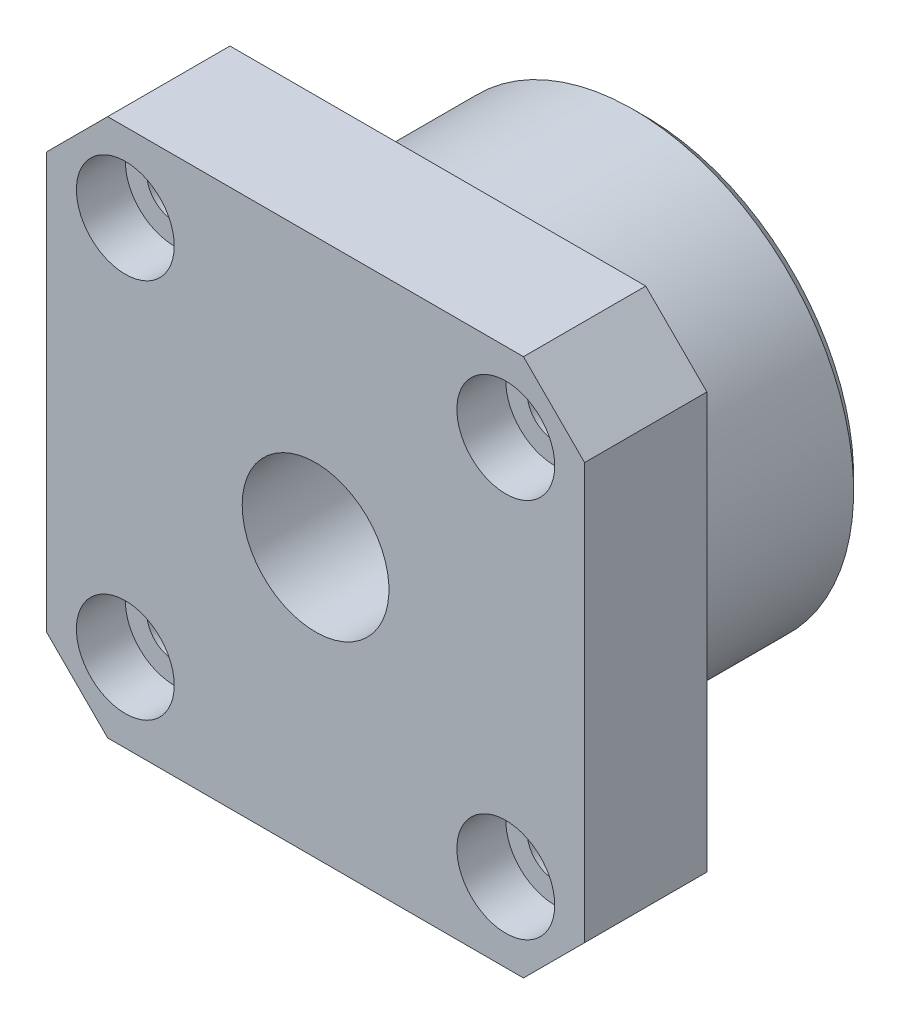
ISO-10303-21;
HEADER;
FILE_DESCRIPTION(('STEP AP214'),'2;1');
FILE_NAME('part.step','',(''),(''),'','','');
FILE_SCHEMA(('AUTOMOTIVE_DESIGN { 1 0 10303 214 1 1 1 1 }'));
ENDSEC;
DATA;
#1=APPLICATION_CONTEXT('core data for automotive mechanical design processes');
#2=APPLICATION_PROTOCOL_DEFINITION('international standard','automotive_design',2000,#1);
#3=PRODUCT_CONTEXT('',#1,'mechanical');
#4=PRODUCT('Part','Part','',(#3));
#5=PRODUCT_RELATED_PRODUCT_CATEGORY('part','',(#4));
#6=PRODUCT_DEFINITION_FORMATION('','',#4);
#7=PRODUCT_DEFINITION_CONTEXT('part definition',#1,'design');
#8=PRODUCT_DEFINITION('design','',#6,#7);
#9=PRODUCT_DEFINITION_SHAPE('','',#8);
#10=(LENGTH_UNIT() NAMED_UNIT(*) SI_UNIT(.MILLI.,.METRE.));
#11=(NAMED_UNIT(*) PLANE_ANGLE_UNIT() SI_UNIT($,.RADIAN.));
#12=(NAMED_UNIT(*) SI_UNIT($,.STERADIAN.) SOLID_ANGLE_UNIT());
#13=UNCERTAINTY_MEASURE_WITH_UNIT(LENGTH_MEASURE(1.E-05),#10,'distance_accuracy_value','');
#14=(GEOMETRIC_REPRESENTATION_CONTEXT(3) GLOBAL_UNCERTAINTY_ASSIGNED_CONTEXT((#13)) GLOBAL_UNIT_ASSIGNED_CONTEXT((#10,
#11,#12)) REPRESENTATION_CONTEXT('',''));
#15=CARTESIAN_POINT('',(0.,0.,0.));
#16=DIRECTION('',(0.,0.,1.));
#17=DIRECTION('',(1.,0.,0.));
#18=AXIS2_PLACEMENT_3D('',#15,#16,#17);
#19=CARTESIAN_POINT('',(0.,0.,0.));
#20=DIRECTION('',(0.,0.,-1.));
#21=DIRECTION('',(-1.,0.,0.));
#22=AXIS2_PLACEMENT_3D('',#19,#20,#21);
#23=PLANE('',#22);
#24=CARTESIAN_POINT('',(-15.5563491861042,-15.5563491861039,0.));
#25=DIRECTION('',(0.,0.,-1.));
#26=DIRECTION('',(-1.,0.,0.));
#27=AXIS2_PLACEMENT_3D('',#24,#25,#26);
#28=CIRCLE('',#27,2.25);
#29=CARTESIAN_POINT('',(-17.8063491861042,-15.5563491861039,0.));
#30=VERTEX_POINT('',#29);
#31=EDGE_CURVE('E134',#30,#30,#28,.T.);
#32=ORIENTED_EDGE('',*,*,#31,.F.);
#33=EDGE_LOOP('',(#32));
#34=FACE_BOUND('',#33,.T.);
#35=CARTESIAN_POINT('',(15.5563491861041,-15.556349186104,0.));
#36=DIRECTION('',(0.,0.,-1.));
#37=DIRECTION('',(-1.,0.,0.));
#38=AXIS2_PLACEMENT_3D('',#35,#36,#37);
#39=CIRCLE('',#38,2.25);
#40=CARTESIAN_POINT('',(13.3063491861041,-15.556349186104,0.));
#41=VERTEX_POINT('',#40);
#42=EDGE_CURVE('E129',#41,#41,#39,.T.);
#43=ORIENTED_EDGE('',*,*,#42,.F.);
#44=EDGE_LOOP('',(#43));
#45=FACE_BOUND('',#44,.T.);
#46=CARTESIAN_POINT('',(15.556349186104,15.556349186104,0.));
#47=DIRECTION('',(0.,0.,-1.));
#48=DIRECTION('',(-1.,0.,0.));
#49=AXIS2_PLACEMENT_3D('',#46,#47,#48);
#50=CIRCLE('',#49,2.25);
#51=CARTESIAN_POINT('',(13.306349186104,15.556349186104,0.));
#52=VERTEX_POINT('',#51);
#53=EDGE_CURVE('E124',#52,#52,#50,.T.);
#54=ORIENTED_EDGE('',*,*,#53,.F.);
#55=EDGE_LOOP('',(#54));
#56=FACE_BOUND('',#55,.T.);
#57=CARTESIAN_POINT('',(-15.5563491861041,15.556349186104,0.));
#58=DIRECTION('',(0.,0.,-1.));
#59=DIRECTION('',(-1.,0.,0.));
#60=AXIS2_PLACEMENT_3D('',#57,#58,#59);
#61=CIRCLE('',#60,2.25);
#62=CARTESIAN_POINT('',(-17.8063491861041,15.556349186104,0.));
#63=VERTEX_POINT('',#62);
#64=EDGE_CURVE('E119',#63,#63,#61,.T.);
#65=ORIENTED_EDGE('',*,*,#64,.F.);
#66=EDGE_LOOP('',(#65));
#67=FACE_BOUND('',#66,.T.);
#68=DIRECTION('',(1.,0.,0.));
#69=VECTOR('',#68,1.);
#70=CARTESIAN_POINT('',(-22.,-22.,0.));
#71=LINE('',#70,#69);
#72=CARTESIAN_POINT('',(-17.,-22.,0.));
#73=VERTEX_POINT('',#72);
#74=CARTESIAN_POINT('',(17.,-22.,0.));
#75=VERTEX_POINT('',#74);
#76=EDGE_CURVE('E101',#73,#75,#71,.T.);
#77=ORIENTED_EDGE('',*,*,#76,.F.);
#78=DIRECTION('',(0.707106781186546,-0.707106781186549,0.));
#79=VECTOR('',#78,1.);
#80=CARTESIAN_POINT('',(-19.5,-19.5,0.));
#81=LINE('',#80,#79);
#82=CARTESIAN_POINT('',(-22.,-17.,0.));
#83=VERTEX_POINT('',#82);
#84=EDGE_CURVE('E84',#73,#83,#81,.F.);
#85=ORIENTED_EDGE('',*,*,#84,.T.);
#86=DIRECTION('',(0.,-1.,0.));
#87=VECTOR('',#86,1.);
#88=CARTESIAN_POINT('',(-22.,-22.,0.));
#89=LINE('',#88,#87);
#90=CARTESIAN_POINT('',(-22.,17.,0.));
#91=VERTEX_POINT('',#90);
#92=EDGE_CURVE('E111',#91,#83,#89,.T.);
#93=ORIENTED_EDGE('',*,*,#92,.F.);
#94=DIRECTION('',(-0.707106781186549,-0.707106781186546,0.));
#95=VECTOR('',#94,1.);
#96=CARTESIAN_POINT('',(-19.5,19.5,0.));
#97=LINE('',#96,#95);
#98=CARTESIAN_POINT('',(-17.,22.,0.));
#99=VERTEX_POINT('',#98);
#100=EDGE_CURVE('E105',#91,#99,#97,.F.);
#101=ORIENTED_EDGE('',*,*,#100,.T.);
#102=DIRECTION('',(-1.,0.,0.));
#103=VECTOR('',#102,1.);
#104=CARTESIAN_POINT('',(-22.,22.,0.));
#105=LINE('',#104,#103);
#106=CARTESIAN_POINT('',(17.,22.,0.));
#107=VERTEX_POINT('',#106);
#108=EDGE_CURVE('E115',#107,#99,#105,.T.);
#109=ORIENTED_EDGE('',*,*,#108,.F.);
#110=DIRECTION('',(-0.707106781186546,0.707106781186549,0.));
#111=VECTOR('',#110,1.);
#112=CARTESIAN_POINT('',(19.5,19.5,0.));
#113=LINE('',#112,#111);
#114=CARTESIAN_POINT('',(22.,17.,0.));
#115=VERTEX_POINT('',#114);
#116=EDGE_CURVE('E141',#107,#115,#113,.F.);
#117=ORIENTED_EDGE('',*,*,#116,.T.);
#118=DIRECTION('',(0.,1.,0.));
#119=VECTOR('',#118,1.);
#120=CARTESIAN_POINT('',(22.,-22.,0.));
#121=LINE('',#120,#119);
#122=CARTESIAN_POINT('',(22.,-17.,0.));
#123=VERTEX_POINT('',#122);
#124=EDGE_CURVE('E217',#123,#115,#121,.T.);
#125=ORIENTED_EDGE('',*,*,#124,.F.);
#126=DIRECTION('',(0.707106781186549,0.707106781186546,0.));
#127=VECTOR('',#126,1.);
#128=CARTESIAN_POINT('',(19.5,-19.5,0.));
#129=LINE('',#128,#127);
#130=EDGE_CURVE('E95',#123,#75,#129,.F.);
#131=ORIENTED_EDGE('',*,*,#130,.T.);
#132=EDGE_LOOP('',(#77,#85,#93,#101,#109,#117,#125,#131));
#133=FACE_BOUND('',#132,.T.);
#134=CARTESIAN_POINT('',(0.,0.,0.));
#135=DIRECTION('',(0.,0.,-1.));
#136=DIRECTION('',(-1.,0.,0.));
#137=AXIS2_PLACEMENT_3D('',#134,#135,#136);
#138=CIRCLE('',#137,18.);
#139=CARTESIAN_POINT('',(-18.,0.,0.));
#140=VERTEX_POINT('',#139);
#141=EDGE_CURVE('E218',#140,#140,#138,.T.);
#142=ORIENTED_EDGE('',*,*,#141,.F.);
#143=EDGE_LOOP('',(#142));
#144=FACE_BOUND('',#143,.T.);
#145=ADVANCED_FACE('F17',(#34,#45,#56,#67,#133,#144),#23,.T.);
#146=CARTESIAN_POINT('',(22.,-22.,10.));
#147=DIRECTION('',(-1.,0.,0.));
#148=DIRECTION('',(0.,0.,1.));
#149=AXIS2_PLACEMENT_3D('',#146,#147,#148);
#150=PLANE('',#149);
#151=DIRECTION('',(0.,1.,0.));
#152=VECTOR('',#151,1.);
#153=CARTESIAN_POINT('',(22.,-22.,10.));
#154=LINE('',#153,#152);
#155=CARTESIAN_POINT('',(22.,-17.,10.));
#156=VERTEX_POINT('',#155);
#157=CARTESIAN_POINT('',(22.,17.,10.));
#158=VERTEX_POINT('',#157);
#159=EDGE_CURVE('E110',#156,#158,#154,.T.);
#160=ORIENTED_EDGE('',*,*,#159,.F.);
#161=DIRECTION('',(0.,0.,-1.));
#162=VECTOR('',#161,1.);
#163=CARTESIAN_POINT('',(22.,-17.,10.));
#164=LINE('',#163,#162);
#165=EDGE_CURVE('E156',#156,#123,#164,.T.);
#166=ORIENTED_EDGE('',*,*,#165,.T.);
#167=ORIENTED_EDGE('',*,*,#124,.T.);
#168=DIRECTION('',(0.,0.,1.));
#169=VECTOR('',#168,1.);
#170=CARTESIAN_POINT('',(22.,17.,10.));
#171=LINE('',#170,#169);
#172=EDGE_CURVE('E154',#115,#158,#171,.T.);
#173=ORIENTED_EDGE('',*,*,#172,.T.);
#174=EDGE_LOOP('',(#160,#166,#167,#173));
#175=FACE_BOUND('',#174,.T.);
#176=ADVANCED_FACE('F179',(#175),#150,.F.);
#177=CARTESIAN_POINT('',(-22.,22.,10.));
#178=DIRECTION('',(0.,-1.,0.));
#179=DIRECTION('',(0.,0.,-1.));
#180=AXIS2_PLACEMENT_3D('',#177,#178,#179);
#181=PLANE('',#180);
#182=DIRECTION('',(-1.,0.,0.));
#183=VECTOR('',#182,1.);
#184=CARTESIAN_POINT('',(-22.,22.,10.));
#185=LINE('',#184,#183);
#186=CARTESIAN_POINT('',(17.,22.,10.));
#187=VERTEX_POINT('',#186);
#188=CARTESIAN_POINT('',(-17.,22.,10.));
#189=VERTEX_POINT('',#188);
#190=EDGE_CURVE('E113',#187,#189,#185,.T.);
#191=ORIENTED_EDGE('',*,*,#190,.F.);
#192=DIRECTION('',(0.,0.,-1.));
#193=VECTOR('',#192,1.);
#194=CARTESIAN_POINT('',(17.,22.,10.));
#195=LINE('',#194,#193);
#196=EDGE_CURVE('E160',#187,#107,#195,.T.);
#197=ORIENTED_EDGE('',*,*,#196,.T.);
#198=ORIENTED_EDGE('',*,*,#108,.T.);
#199=DIRECTION('',(0.,0.,1.));
#200=VECTOR('',#199,1.);
#201=CARTESIAN_POINT('',(-17.,22.,10.));
#202=LINE('',#201,#200);
#203=EDGE_CURVE('E32',#99,#189,#202,.T.);
#204=ORIENTED_EDGE('',*,*,#203,.T.);
#205=EDGE_LOOP('',(#191,#197,#198,#204));
#206=FACE_BOUND('',#205,.T.);
#207=ADVANCED_FACE('F185',(#206),#181,.F.);
#208=CARTESIAN_POINT('',(-22.,-22.,10.));
#209=DIRECTION('',(1.,0.,0.));
#210=DIRECTION('',(0.,0.,-1.));
#211=AXIS2_PLACEMENT_3D('',#208,#209,#210);
#212=PLANE('',#211);
#213=ORIENTED_EDGE('',*,*,#92,.T.);
#214=DIRECTION('',(0.,0.,1.));
#215=VECTOR('',#214,1.);
#216=CARTESIAN_POINT('',(-22.,-17.,10.));
#217=LINE('',#216,#215);
#218=CARTESIAN_POINT('',(-22.,-17.,10.));
#219=VERTEX_POINT('',#218);
#220=EDGE_CURVE('E89',#83,#219,#217,.T.);
#221=ORIENTED_EDGE('',*,*,#220,.T.);
#222=DIRECTION('',(0.,-1.,0.));
#223=VECTOR('',#222,1.);
#224=CARTESIAN_POINT('',(-22.,-22.,10.));
#225=LINE('',#224,#223);
#226=CARTESIAN_POINT('',(-22.,17.,10.));
#227=VERTEX_POINT('',#226);
#228=EDGE_CURVE('E222',#227,#219,#225,.T.);
#229=ORIENTED_EDGE('',*,*,#228,.F.);
#230=DIRECTION('',(0.,0.,-1.));
#231=VECTOR('',#230,1.);
#232=CARTESIAN_POINT('',(-22.,17.,10.));
#233=LINE('',#232,#231);
#234=EDGE_CURVE('E94',#227,#91,#233,.T.);
#235=ORIENTED_EDGE('',*,*,#234,.T.);
#236=EDGE_LOOP('',(#213,#221,#229,#235));
#237=FACE_BOUND('',#236,.T.);
#238=ADVANCED_FACE('F196',(#237),#212,.F.);
#239=CARTESIAN_POINT('',(-22.,-22.,10.));
#240=DIRECTION('',(0.,1.,0.));
#241=DIRECTION('',(0.,0.,1.));
#242=AXIS2_PLACEMENT_3D('',#239,#240,#241);
#243=PLANE('',#242);
#244=DIRECTION('',(1.,0.,0.));
#245=VECTOR('',#244,1.);
#246=CARTESIAN_POINT('',(-22.,-22.,10.));
#247=LINE('',#246,#245);
#248=CARTESIAN_POINT('',(-17.,-22.,10.));
#249=VERTEX_POINT('',#248);
#250=CARTESIAN_POINT('',(17.,-22.,10.));
#251=VERTEX_POINT('',#250);
#252=EDGE_CURVE('E104',#249,#251,#247,.T.);
#253=ORIENTED_EDGE('',*,*,#252,.F.);
#254=DIRECTION('',(0.,0.,-1.));
#255=VECTOR('',#254,1.);
#256=CARTESIAN_POINT('',(-17.,-22.,10.));
#257=LINE('',#256,#255);
#258=EDGE_CURVE('E88',#249,#73,#257,.T.);
#259=ORIENTED_EDGE('',*,*,#258,.T.);
#260=ORIENTED_EDGE('',*,*,#76,.T.);
#261=DIRECTION('',(0.,0.,1.));
#262=VECTOR('',#261,1.);
#263=CARTESIAN_POINT('',(17.,-22.,10.));
#264=LINE('',#263,#262);
#265=EDGE_CURVE('E106',#75,#251,#264,.T.);
#266=ORIENTED_EDGE('',*,*,#265,.T.);
#267=EDGE_LOOP('',(#253,#259,#260,#266));
#268=FACE_BOUND('',#267,.T.);
#269=ADVANCED_FACE('F100',(#268),#243,.F.);
#270=CARTESIAN_POINT('',(0.,0.,10.));
#271=DIRECTION('',(0.,0.,-1.));
#272=DIRECTION('',(-1.,0.,0.));
#273=AXIS2_PLACEMENT_3D('',#270,#271,#272);
#274=PLANE('',#273);
#275=CARTESIAN_POINT('',(-15.5563491861042,-15.5563491861039,10.));
#276=DIRECTION('',(0.,0.,1.));
#277=DIRECTION('',(1.,0.,0.));
#278=AXIS2_PLACEMENT_3D('',#275,#276,#277);
#279=CIRCLE('',#278,4.);
#280=CARTESIAN_POINT('',(-11.5563491861042,-15.5563491861039,10.));
#281=VERTEX_POINT('',#280);
#282=EDGE_CURVE('E259',#281,#281,#279,.T.);
#283=ORIENTED_EDGE('',*,*,#282,.F.);
#284=EDGE_LOOP('',(#283));
#285=FACE_BOUND('',#284,.T.);
#286=CARTESIAN_POINT('',(15.5563491861041,-15.556349186104,10.));
#287=DIRECTION('',(0.,0.,1.));
#288=DIRECTION('',(1.,0.,0.));
#289=AXIS2_PLACEMENT_3D('',#286,#287,#288);
#290=CIRCLE('',#289,4.);
#291=CARTESIAN_POINT('',(19.5563491861041,-15.556349186104,10.));
#292=VERTEX_POINT('',#291);
#293=EDGE_CURVE('E137',#292,#292,#290,.T.);
#294=ORIENTED_EDGE('',*,*,#293,.F.);
#295=EDGE_LOOP('',(#294));
#296=FACE_BOUND('',#295,.T.);
#297=CARTESIAN_POINT('',(15.556349186104,15.556349186104,10.));
#298=DIRECTION('',(0.,0.,1.));
#299=DIRECTION('',(1.,0.,0.));
#300=AXIS2_PLACEMENT_3D('',#297,#298,#299);
#301=CIRCLE('',#300,4.);
#302=CARTESIAN_POINT('',(19.5563491861041,15.556349186104,10.));
#303=VERTEX_POINT('',#302);
#304=EDGE_CURVE('E132',#303,#303,#301,.T.);
#305=ORIENTED_EDGE('',*,*,#304,.F.);
#306=EDGE_LOOP('',(#305));
#307=FACE_BOUND('',#306,.T.);
#308=CARTESIAN_POINT('',(-15.5563491861041,15.556349186104,10.));
#309=DIRECTION('',(0.,0.,1.));
#310=DIRECTION('',(1.,0.,0.));
#311=AXIS2_PLACEMENT_3D('',#308,#309,#310);
#312=CIRCLE('',#311,4.);
#313=CARTESIAN_POINT('',(-11.5563491861041,15.556349186104,10.));
#314=VERTEX_POINT('',#313);
#315=EDGE_CURVE('E127',#314,#314,#312,.T.);
#316=ORIENTED_EDGE('',*,*,#315,.F.);
#317=EDGE_LOOP('',(#316));
#318=FACE_BOUND('',#317,.T.);
#319=CARTESIAN_POINT('',(0.,0.,10.));
#320=DIRECTION('',(0.,0.,-1.));
#321=DIRECTION('',(-1.,0.,0.));
#322=AXIS2_PLACEMENT_3D('',#319,#320,#321);
#323=CIRCLE('',#322,6.);
#324=CARTESIAN_POINT('',(-6.,0.,10.));
#325=VERTEX_POINT('',#324);
#326=EDGE_CURVE('E228',#325,#325,#323,.T.);
#327=ORIENTED_EDGE('',*,*,#326,.T.);
#328=EDGE_LOOP('',(#327));
#329=FACE_BOUND('',#328,.T.);
#330=ORIENTED_EDGE('',*,*,#228,.T.);
#331=DIRECTION('',(-0.707106781186546,0.707106781186549,0.));
#332=VECTOR('',#331,1.);
#333=CARTESIAN_POINT('',(-17.,-22.,10.));
#334=LINE('',#333,#332);
#335=EDGE_CURVE('E152',#219,#249,#334,.F.);
#336=ORIENTED_EDGE('',*,*,#335,.T.);
#337=ORIENTED_EDGE('',*,*,#252,.T.);
#338=DIRECTION('',(-0.707106781186549,-0.707106781186546,0.));
#339=VECTOR('',#338,1.);
#340=CARTESIAN_POINT('',(22.,-17.,10.));
#341=LINE('',#340,#339);
#342=EDGE_CURVE('E150',#251,#156,#341,.F.);
#343=ORIENTED_EDGE('',*,*,#342,.T.);
#344=ORIENTED_EDGE('',*,*,#159,.T.);
#345=DIRECTION('',(0.707106781186546,-0.707106781186549,0.));
#346=VECTOR('',#345,1.);
#347=CARTESIAN_POINT('',(17.,22.,10.));
#348=LINE('',#347,#346);
#349=EDGE_CURVE('E39',#158,#187,#348,.F.);
#350=ORIENTED_EDGE('',*,*,#349,.T.);
#351=ORIENTED_EDGE('',*,*,#190,.T.);
#352=DIRECTION('',(0.707106781186549,0.707106781186546,0.));
#353=VECTOR('',#352,1.);
#354=CARTESIAN_POINT('',(-22.,17.,10.));
#355=LINE('',#354,#353);
#356=EDGE_CURVE('E147',#189,#227,#355,.F.);
#357=ORIENTED_EDGE('',*,*,#356,.T.);
#358=EDGE_LOOP('',(#330,#336,#337,#343,#344,#350,#351,#357));
#359=FACE_BOUND('',#358,.T.);
#360=ADVANCED_FACE('F192',(#285,#296,#307,#318,#329,#359),#274,.F.);
#361=CARTESIAN_POINT('',(0.,0.,-17.));
#362=DIRECTION('',(0.,0.,1.));
#363=DIRECTION('',(1.,0.,0.));
#364=AXIS2_PLACEMENT_3D('',#361,#362,#363);
#365=CYLINDRICAL_SURFACE('',#364,18.);
#366=CARTESIAN_POINT('',(0.,0.,-16.));
#367=DIRECTION('',(0.,0.,-1.));
#368=DIRECTION('',(-1.,0.,0.));
#369=AXIS2_PLACEMENT_3D('',#366,#367,#368);
#370=CIRCLE('',#369,18.);
#371=CARTESIAN_POINT('',(-18.,0.,-16.));
#372=VERTEX_POINT('',#371);
#373=EDGE_CURVE('E11',#372,#372,#370,.F.);
#374=ORIENTED_EDGE('',*,*,#373,.T.);
#375=EDGE_LOOP('',(#374));
#376=FACE_BOUND('',#375,.T.);
#377=ORIENTED_EDGE('',*,*,#141,.T.);
#378=EDGE_LOOP('',(#377));
#379=FACE_BOUND('',#378,.T.);
#380=ADVANCED_FACE('F266',(#376,#379),#365,.T.);
#381=CARTESIAN_POINT('',(0.,0.,-17.));
#382=DIRECTION('',(0.,0.,-1.));
#383=DIRECTION('',(-1.,0.,0.));
#384=AXIS2_PLACEMENT_3D('',#381,#382,#383);
#385=PLANE('',#384);
#386=CARTESIAN_POINT('',(0.,0.,-17.));
#387=DIRECTION('',(0.,0.,-1.));
#388=DIRECTION('',(-1.,0.,0.));
#389=AXIS2_PLACEMENT_3D('',#386,#387,#388);
#390=CIRCLE('',#389,17.);
#391=CARTESIAN_POINT('',(-17.,0.,-17.));
#392=VERTEX_POINT('',#391);
#393=EDGE_CURVE('E25',#392,#392,#390,.T.);
#394=ORIENTED_EDGE('',*,*,#393,.T.);
#395=EDGE_LOOP('',(#394));
#396=FACE_BOUND('',#395,.T.);
#397=CARTESIAN_POINT('',(0.,0.,-17.));
#398=DIRECTION('',(0.,0.,-1.));
#399=DIRECTION('',(-1.,0.,0.));
#400=AXIS2_PLACEMENT_3D('',#397,#398,#399);
#401=CIRCLE('',#400,6.);
#402=CARTESIAN_POINT('',(-6.,0.,-17.));
#403=VERTEX_POINT('',#402);
#404=EDGE_CURVE('E122',#403,#403,#401,.T.);
#405=ORIENTED_EDGE('',*,*,#404,.F.);
#406=EDGE_LOOP('',(#405));
#407=FACE_BOUND('',#406,.T.);
#408=ADVANCED_FACE('F165',(#396,#407),#385,.T.);
#409=CARTESIAN_POINT('',(0.,0.,10.));
#410=DIRECTION('',(0.,0.,-1.));
#411=DIRECTION('',(-1.,0.,0.));
#412=AXIS2_PLACEMENT_3D('',#409,#410,#411);
#413=CYLINDRICAL_SURFACE('',#412,6.);
#414=ORIENTED_EDGE('',*,*,#326,.F.);
#415=EDGE_LOOP('',(#414));
#416=FACE_BOUND('',#415,.T.);
#417=ORIENTED_EDGE('',*,*,#404,.T.);
#418=EDGE_LOOP('',(#417));
#419=FACE_BOUND('',#418,.T.);
#420=ADVANCED_FACE('F281',(#416,#419),#413,.F.);
#421=CARTESIAN_POINT('',(-15.5563491861041,15.556349186104,10.));
#422=DIRECTION('',(0.,0.,1.));
#423=DIRECTION('',(1.,0.,0.));
#424=AXIS2_PLACEMENT_3D('',#421,#422,#423);
#425=CYLINDRICAL_SURFACE('',#424,2.25);
#426=ORIENTED_EDGE('',*,*,#64,.T.);
#427=EDGE_LOOP('',(#426));
#428=FACE_BOUND('',#427,.T.);
#429=CARTESIAN_POINT('',(-15.5563491861041,15.556349186104,6.));
#430=DIRECTION('',(0.,0.,1.));
#431=DIRECTION('',(1.,0.,0.));
#432=AXIS2_PLACEMENT_3D('',#429,#430,#431);
#433=CIRCLE('',#432,2.25);
#434=CARTESIAN_POINT('',(-13.3063491861041,15.556349186104,6.));
#435=VERTEX_POINT('',#434);
#436=EDGE_CURVE('E123',#435,#435,#433,.T.);
#437=ORIENTED_EDGE('',*,*,#436,.T.);
#438=EDGE_LOOP('',(#437));
#439=FACE_BOUND('',#438,.T.);
#440=ADVANCED_FACE('F284',(#428,#439),#425,.F.);
#441=CARTESIAN_POINT('',(-13.3063491861041,15.556349186104,6.));
#442=DIRECTION('',(0.,0.,-1.));
#443=DIRECTION('',(-1.,0.,0.));
#444=AXIS2_PLACEMENT_3D('',#441,#442,#443);
#445=PLANE('',#444);
#446=ORIENTED_EDGE('',*,*,#436,.F.);
#447=EDGE_LOOP('',(#446));
#448=FACE_BOUND('',#447,.T.);
#449=CARTESIAN_POINT('',(-15.5563491861041,15.556349186104,6.));
#450=DIRECTION('',(0.,0.,1.));
#451=DIRECTION('',(1.,0.,0.));
#452=AXIS2_PLACEMENT_3D('',#449,#450,#451);
#453=CIRCLE('',#452,4.);
#454=CARTESIAN_POINT('',(-11.5563491861041,15.556349186104,6.));
#455=VERTEX_POINT('',#454);
#456=EDGE_CURVE('E235',#455,#455,#453,.T.);
#457=ORIENTED_EDGE('',*,*,#456,.T.);
#458=EDGE_LOOP('',(#457));
#459=FACE_BOUND('',#458,.T.);
#460=ADVANCED_FACE('F296',(#448,#459),#445,.F.);
#461=CARTESIAN_POINT('',(-15.5563491861041,15.556349186104,10.));
#462=DIRECTION('',(0.,0.,1.));
#463=DIRECTION('',(1.,0.,0.));
#464=AXIS2_PLACEMENT_3D('',#461,#462,#463);
#465=CYLINDRICAL_SURFACE('',#464,4.);
#466=ORIENTED_EDGE('',*,*,#456,.F.);
#467=EDGE_LOOP('',(#466));
#468=FACE_BOUND('',#467,.T.);
#469=ORIENTED_EDGE('',*,*,#315,.T.);
#470=EDGE_LOOP('',(#469));
#471=FACE_BOUND('',#470,.T.);
#472=ADVANCED_FACE('F300',(#468,#471),#465,.F.);
#473=CARTESIAN_POINT('',(15.556349186104,15.556349186104,10.));
#474=DIRECTION('',(0.,0.,1.));
#475=DIRECTION('',(1.,0.,0.));
#476=AXIS2_PLACEMENT_3D('',#473,#474,#475);
#477=CYLINDRICAL_SURFACE('',#476,2.25);
#478=ORIENTED_EDGE('',*,*,#53,.T.);
#479=EDGE_LOOP('',(#478));
#480=FACE_BOUND('',#479,.T.);
#481=CARTESIAN_POINT('',(15.556349186104,15.556349186104,6.));
#482=DIRECTION('',(0.,0.,1.));
#483=DIRECTION('',(1.,0.,0.));
#484=AXIS2_PLACEMENT_3D('',#481,#482,#483);
#485=CIRCLE('',#484,2.25);
#486=CARTESIAN_POINT('',(17.806349186104,15.556349186104,6.));
#487=VERTEX_POINT('',#486);
#488=EDGE_CURVE('E128',#487,#487,#485,.T.);
#489=ORIENTED_EDGE('',*,*,#488,.T.);
#490=EDGE_LOOP('',(#489));
#491=FACE_BOUND('',#490,.T.);
#492=ADVANCED_FACE('F304',(#480,#491),#477,.F.);
#493=CARTESIAN_POINT('',(17.8063491861041,15.556349186104,6.));
#494=DIRECTION('',(0.,0.,-1.));
#495=DIRECTION('',(-1.,0.,0.));
#496=AXIS2_PLACEMENT_3D('',#493,#494,#495);
#497=PLANE('',#496);
#498=ORIENTED_EDGE('',*,*,#488,.F.);
#499=EDGE_LOOP('',(#498));
#500=FACE_BOUND('',#499,.T.);
#501=CARTESIAN_POINT('',(15.556349186104,15.556349186104,6.));
#502=DIRECTION('',(0.,0.,1.));
#503=DIRECTION('',(1.,0.,0.));
#504=AXIS2_PLACEMENT_3D('',#501,#502,#503);
#505=CIRCLE('',#504,4.);
#506=CARTESIAN_POINT('',(19.5563491861041,15.556349186104,6.));
#507=VERTEX_POINT('',#506);
#508=EDGE_CURVE('E242',#507,#507,#505,.T.);
#509=ORIENTED_EDGE('',*,*,#508,.T.);
#510=EDGE_LOOP('',(#509));
#511=FACE_BOUND('',#510,.T.);
#512=ADVANCED_FACE('F308',(#500,#511),#497,.F.);
#513=CARTESIAN_POINT('',(15.556349186104,15.556349186104,10.));
#514=DIRECTION('',(0.,0.,1.));
#515=DIRECTION('',(1.,0.,0.));
#516=AXIS2_PLACEMENT_3D('',#513,#514,#515);
#517=CYLINDRICAL_SURFACE('',#516,4.);
#518=ORIENTED_EDGE('',*,*,#508,.F.);
#519=EDGE_LOOP('',(#518));
#520=FACE_BOUND('',#519,.T.);
#521=ORIENTED_EDGE('',*,*,#304,.T.);
#522=EDGE_LOOP('',(#521));
#523=FACE_BOUND('',#522,.T.);
#524=ADVANCED_FACE('F312',(#520,#523),#517,.F.);
#525=CARTESIAN_POINT('',(15.5563491861041,-15.556349186104,10.));
#526=DIRECTION('',(0.,0.,1.));
#527=DIRECTION('',(1.,0.,0.));
#528=AXIS2_PLACEMENT_3D('',#525,#526,#527);
#529=CYLINDRICAL_SURFACE('',#528,2.25);
#530=ORIENTED_EDGE('',*,*,#42,.T.);
#531=EDGE_LOOP('',(#530));
#532=FACE_BOUND('',#531,.T.);
#533=CARTESIAN_POINT('',(15.5563491861041,-15.556349186104,6.));
#534=DIRECTION('',(0.,0.,1.));
#535=DIRECTION('',(1.,0.,0.));
#536=AXIS2_PLACEMENT_3D('',#533,#534,#535);
#537=CIRCLE('',#536,2.25);
#538=CARTESIAN_POINT('',(17.8063491861041,-15.556349186104,6.));
#539=VERTEX_POINT('',#538);
#540=EDGE_CURVE('E133',#539,#539,#537,.T.);
#541=ORIENTED_EDGE('',*,*,#540,.T.);
#542=EDGE_LOOP('',(#541));
#543=FACE_BOUND('',#542,.T.);
#544=ADVANCED_FACE('F316',(#532,#543),#529,.F.);
#545=CARTESIAN_POINT('',(17.8063491861041,-15.556349186104,6.));
#546=DIRECTION('',(0.,0.,-1.));
#547=DIRECTION('',(-1.,0.,0.));
#548=AXIS2_PLACEMENT_3D('',#545,#546,#547);
#549=PLANE('',#548);
#550=ORIENTED_EDGE('',*,*,#540,.F.);
#551=EDGE_LOOP('',(#550));
#552=FACE_BOUND('',#551,.T.);
#553=CARTESIAN_POINT('',(15.5563491861041,-15.556349186104,6.));
#554=DIRECTION('',(0.,0.,1.));
#555=DIRECTION('',(1.,0.,0.));
#556=AXIS2_PLACEMENT_3D('',#553,#554,#555);
#557=CIRCLE('',#556,4.);
#558=CARTESIAN_POINT('',(19.5563491861041,-15.556349186104,6.));
#559=VERTEX_POINT('',#558);
#560=EDGE_CURVE('E249',#559,#559,#557,.T.);
#561=ORIENTED_EDGE('',*,*,#560,.T.);
#562=EDGE_LOOP('',(#561));
#563=FACE_BOUND('',#562,.T.);
#564=ADVANCED_FACE('F320',(#552,#563),#549,.F.);
#565=CARTESIAN_POINT('',(15.5563491861041,-15.556349186104,10.));
#566=DIRECTION('',(0.,0.,1.));
#567=DIRECTION('',(1.,0.,0.));
#568=AXIS2_PLACEMENT_3D('',#565,#566,#567);
#569=CYLINDRICAL_SURFACE('',#568,4.);
#570=ORIENTED_EDGE('',*,*,#560,.F.);
#571=EDGE_LOOP('',(#570));
#572=FACE_BOUND('',#571,.T.);
#573=ORIENTED_EDGE('',*,*,#293,.T.);
#574=EDGE_LOOP('',(#573));
#575=FACE_BOUND('',#574,.T.);
#576=ADVANCED_FACE('F324',(#572,#575),#569,.F.);
#577=CARTESIAN_POINT('',(-15.5563491861042,-15.5563491861039,10.));
#578=DIRECTION('',(0.,0.,1.));
#579=DIRECTION('',(1.,0.,0.));
#580=AXIS2_PLACEMENT_3D('',#577,#578,#579);
#581=CYLINDRICAL_SURFACE('',#580,2.25);
#582=ORIENTED_EDGE('',*,*,#31,.T.);
#583=EDGE_LOOP('',(#582));
#584=FACE_BOUND('',#583,.T.);
#585=CARTESIAN_POINT('',(-15.5563491861042,-15.5563491861039,6.));
#586=DIRECTION('',(0.,0.,1.));
#587=DIRECTION('',(1.,0.,0.));
#588=AXIS2_PLACEMENT_3D('',#585,#586,#587);
#589=CIRCLE('',#588,2.25);
#590=CARTESIAN_POINT('',(-13.3063491861042,-15.5563491861039,6.));
#591=VERTEX_POINT('',#590);
#592=EDGE_CURVE('E138',#591,#591,#589,.T.);
#593=ORIENTED_EDGE('',*,*,#592,.T.);
#594=EDGE_LOOP('',(#593));
#595=FACE_BOUND('',#594,.T.);
#596=ADVANCED_FACE('F328',(#584,#595),#581,.F.);
#597=CARTESIAN_POINT('',(-13.3063491861042,-15.5563491861039,6.));
#598=DIRECTION('',(0.,0.,-1.));
#599=DIRECTION('',(-1.,0.,0.));
#600=AXIS2_PLACEMENT_3D('',#597,#598,#599);
#601=PLANE('',#600);
#602=ORIENTED_EDGE('',*,*,#592,.F.);
#603=EDGE_LOOP('',(#602));
#604=FACE_BOUND('',#603,.T.);
#605=CARTESIAN_POINT('',(-15.5563491861042,-15.5563491861039,6.));
#606=DIRECTION('',(0.,0.,1.));
#607=DIRECTION('',(1.,0.,0.));
#608=AXIS2_PLACEMENT_3D('',#605,#606,#607);
#609=CIRCLE('',#608,4.);
#610=CARTESIAN_POINT('',(-11.5563491861042,-15.5563491861039,6.));
#611=VERTEX_POINT('',#610);
#612=EDGE_CURVE('E256',#611,#611,#609,.T.);
#613=ORIENTED_EDGE('',*,*,#612,.T.);
#614=EDGE_LOOP('',(#613));
#615=FACE_BOUND('',#614,.T.);
#616=ADVANCED_FACE('F332',(#604,#615),#601,.F.);
#617=CARTESIAN_POINT('',(-15.5563491861042,-15.5563491861039,10.));
#618=DIRECTION('',(0.,0.,1.));
#619=DIRECTION('',(1.,0.,0.));
#620=AXIS2_PLACEMENT_3D('',#617,#618,#619);
#621=CYLINDRICAL_SURFACE('',#620,4.);
#622=ORIENTED_EDGE('',*,*,#612,.F.);
#623=EDGE_LOOP('',(#622));
#624=FACE_BOUND('',#623,.T.);
#625=ORIENTED_EDGE('',*,*,#282,.T.);
#626=EDGE_LOOP('',(#625));
#627=FACE_BOUND('',#626,.T.);
#628=ADVANCED_FACE('F205',(#624,#627),#621,.F.);
#629=CARTESIAN_POINT('',(-17.,-22.,10.));
#630=DIRECTION('',(0.707106781186549,0.707106781186546,0.));
#631=DIRECTION('',(0.,0.,-1.));
#632=AXIS2_PLACEMENT_3D('',#629,#630,#631);
#633=PLANE('',#632);
#634=ORIENTED_EDGE('',*,*,#335,.F.);
#635=ORIENTED_EDGE('',*,*,#220,.F.);
#636=ORIENTED_EDGE('',*,*,#84,.F.);
#637=ORIENTED_EDGE('',*,*,#258,.F.);
#638=EDGE_LOOP('',(#634,#635,#636,#637));
#639=FACE_BOUND('',#638,.T.);
#640=ADVANCED_FACE('F87',(#639),#633,.F.);
#641=CARTESIAN_POINT('',(22.,-17.,10.));
#642=DIRECTION('',(-0.707106781186546,0.707106781186549,0.));
#643=DIRECTION('',(0.,0.,-1.));
#644=AXIS2_PLACEMENT_3D('',#641,#642,#643);
#645=PLANE('',#644);
#646=ORIENTED_EDGE('',*,*,#342,.F.);
#647=ORIENTED_EDGE('',*,*,#265,.F.);
#648=ORIENTED_EDGE('',*,*,#130,.F.);
#649=ORIENTED_EDGE('',*,*,#165,.F.);
#650=EDGE_LOOP('',(#646,#647,#648,#649));
#651=FACE_BOUND('',#650,.T.);
#652=ADVANCED_FACE('F204',(#651),#645,.F.);
#653=CARTESIAN_POINT('',(17.,22.,10.));
#654=DIRECTION('',(-0.707106781186549,-0.707106781186546,0.));
#655=DIRECTION('',(0.,0.,-1.));
#656=AXIS2_PLACEMENT_3D('',#653,#654,#655);
#657=PLANE('',#656);
#658=ORIENTED_EDGE('',*,*,#349,.F.);
#659=ORIENTED_EDGE('',*,*,#172,.F.);
#660=ORIENTED_EDGE('',*,*,#116,.F.);
#661=ORIENTED_EDGE('',*,*,#196,.F.);
#662=EDGE_LOOP('',(#658,#659,#660,#661));
#663=FACE_BOUND('',#662,.T.);
#664=ADVANCED_FACE('F175',(#663),#657,.F.);
#665=CARTESIAN_POINT('',(-22.,17.,10.));
#666=DIRECTION('',(0.707106781186546,-0.707106781186549,0.));
#667=DIRECTION('',(0.,0.,-1.));
#668=AXIS2_PLACEMENT_3D('',#665,#666,#667);
#669=PLANE('',#668);
#670=ORIENTED_EDGE('',*,*,#356,.F.);
#671=ORIENTED_EDGE('',*,*,#203,.F.);
#672=ORIENTED_EDGE('',*,*,#100,.F.);
#673=ORIENTED_EDGE('',*,*,#234,.F.);
#674=EDGE_LOOP('',(#670,#671,#672,#673));
#675=FACE_BOUND('',#674,.T.);
#676=ADVANCED_FACE('F169',(#675),#669,.F.);
#677=CARTESIAN_POINT('',(0.,0.,-17.));
#678=DIRECTION('',(0.,0.,1.));
#679=DIRECTION('',(1.,0.,0.));
#680=AXIS2_PLACEMENT_3D('',#677,#678,#679);
#681=CONICAL_SURFACE('',#680,17.,0.785398163397452);
#682=ORIENTED_EDGE('',*,*,#373,.F.);
#683=EDGE_LOOP('',(#682));
#684=FACE_BOUND('',#683,.T.);
#685=ORIENTED_EDGE('',*,*,#393,.F.);
#686=EDGE_LOOP('',(#685));
#687=FACE_BOUND('',#686,.T.);
#688=ADVANCED_FACE('F19',(#684,#687),#681,.T.);
#689=CLOSED_SHELL('',(#145,#176,#207,#238,#269,#360,#380,#408,#420,#440,#460,#472,#492,#512,
#524,#544,#564,#576,#596,#616,#628,#640,#652,#664,#676,#688));
#690=MANIFOLD_SOLID_BREP('B1',#689);
#691=ADVANCED_BREP_SHAPE_REPRESENTATION('',(#18,#690),#14);
#692=SHAPE_DEFINITION_REPRESENTATION(#9,#691);
ENDSEC;
END-ISO-10303-21;
